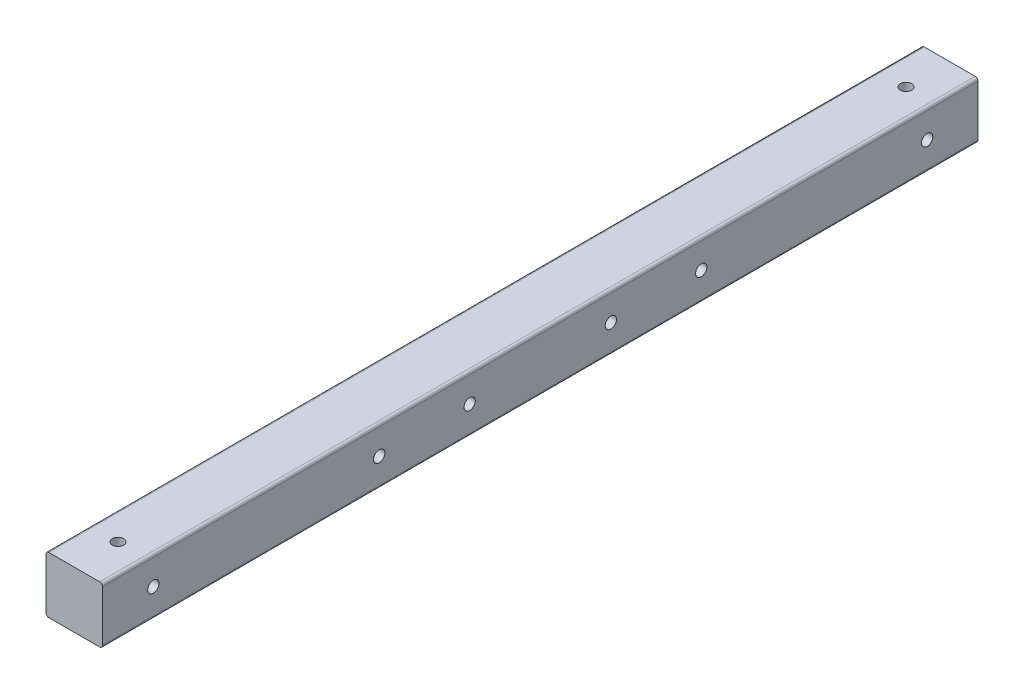
ISO-10303-21;
HEADER;
FILE_DESCRIPTION(('STEP AP214'),'2;1');
FILE_NAME('part.step','',(''),(''),'','','');
FILE_SCHEMA(('AUTOMOTIVE_DESIGN { 1 0 10303 214 1 1 1 1 }'));
ENDSEC;
DATA;
#1=APPLICATION_CONTEXT('core data for automotive mechanical design processes');
#2=APPLICATION_PROTOCOL_DEFINITION('international standard','automotive_design',2000,#1);
#3=PRODUCT_CONTEXT('',#1,'mechanical');
#4=PRODUCT('Part','Part','',(#3));
#5=PRODUCT_RELATED_PRODUCT_CATEGORY('part','',(#4));
#6=PRODUCT_DEFINITION_FORMATION('','',#4);
#7=PRODUCT_DEFINITION_CONTEXT('part definition',#1,'design');
#8=PRODUCT_DEFINITION('design','',#6,#7);
#9=PRODUCT_DEFINITION_SHAPE('','',#8);
#10=(LENGTH_UNIT() NAMED_UNIT(*) SI_UNIT(.MILLI.,.METRE.));
#11=(NAMED_UNIT(*) PLANE_ANGLE_UNIT() SI_UNIT($,.RADIAN.));
#12=(NAMED_UNIT(*) SI_UNIT($,.STERADIAN.) SOLID_ANGLE_UNIT());
#13=UNCERTAINTY_MEASURE_WITH_UNIT(LENGTH_MEASURE(1.E-05),#10,'distance_accuracy_value','');
#14=(GEOMETRIC_REPRESENTATION_CONTEXT(3) GLOBAL_UNCERTAINTY_ASSIGNED_CONTEXT((#13)) GLOBAL_UNIT_ASSIGNED_CONTEXT((#10,
#11,#12)) REPRESENTATION_CONTEXT('',''));
#15=CARTESIAN_POINT('',(0.,0.,0.));
#16=DIRECTION('',(0.,0.,1.));
#17=DIRECTION('',(1.,0.,0.));
#18=AXIS2_PLACEMENT_3D('',#15,#16,#17);
#19=CARTESIAN_POINT('',(0.,0.,310.));
#20=DIRECTION('',(1.,0.,0.));
#21=DIRECTION('',(0.,0.,-1.));
#22=AXIS2_PLACEMENT_3D('',#19,#20,#21);
#23=PLANE('',#22);
#24=CARTESIAN_POINT('',(0.,10.,18.));
#25=DIRECTION('',(-1.,0.,0.));
#26=DIRECTION('',(0.,0.,1.));
#27=AXIS2_PLACEMENT_3D('',#24,#25,#26);
#28=CIRCLE('',#27,2.);
#29=CARTESIAN_POINT('',(0.,10.,20.));
#30=VERTEX_POINT('',#29);
#31=EDGE_CURVE('E352',#30,#30,#28,.T.);
#32=ORIENTED_EDGE('',*,*,#31,.F.);
#33=EDGE_LOOP('',(#32));
#34=FACE_BOUND('',#33,.T.);
#35=CARTESIAN_POINT('',(0.,10.,212.));
#36=DIRECTION('',(-1.,0.,0.));
#37=DIRECTION('',(0.,0.,1.));
#38=AXIS2_PLACEMENT_3D('',#35,#36,#37);
#39=CIRCLE('',#38,2.);
#40=CARTESIAN_POINT('',(0.,10.,214.));
#41=VERTEX_POINT('',#40);
#42=EDGE_CURVE('E340',#41,#41,#39,.T.);
#43=ORIENTED_EDGE('',*,*,#42,.F.);
#44=EDGE_LOOP('',(#43));
#45=FACE_BOUND('',#44,.T.);
#46=CARTESIAN_POINT('',(0.,10.,130.));
#47=DIRECTION('',(-1.,0.,0.));
#48=DIRECTION('',(0.,0.,1.));
#49=AXIS2_PLACEMENT_3D('',#46,#47,#48);
#50=CIRCLE('',#49,2.);
#51=CARTESIAN_POINT('',(0.,10.,132.));
#52=VERTEX_POINT('',#51);
#53=EDGE_CURVE('E343',#52,#52,#50,.T.);
#54=ORIENTED_EDGE('',*,*,#53,.F.);
#55=EDGE_LOOP('',(#54));
#56=FACE_BOUND('',#55,.T.);
#57=CARTESIAN_POINT('',(0.,10.,180.));
#58=DIRECTION('',(-1.,0.,0.));
#59=DIRECTION('',(0.,0.,1.));
#60=AXIS2_PLACEMENT_3D('',#57,#58,#59);
#61=CIRCLE('',#60,2.);
#62=CARTESIAN_POINT('',(0.,10.,182.));
#63=VERTEX_POINT('',#62);
#64=EDGE_CURVE('E347',#63,#63,#61,.T.);
#65=ORIENTED_EDGE('',*,*,#64,.F.);
#66=EDGE_LOOP('',(#65));
#67=FACE_BOUND('',#66,.T.);
#68=CARTESIAN_POINT('',(0.,10.,292.));
#69=DIRECTION('',(-1.,0.,0.));
#70=DIRECTION('',(0.,0.,1.));
#71=AXIS2_PLACEMENT_3D('',#68,#69,#70);
#72=CIRCLE('',#71,2.);
#73=CARTESIAN_POINT('',(0.,10.,294.));
#74=VERTEX_POINT('',#73);
#75=EDGE_CURVE('E350',#74,#74,#72,.T.);
#76=ORIENTED_EDGE('',*,*,#75,.F.);
#77=EDGE_LOOP('',(#76));
#78=FACE_BOUND('',#77,.T.);
#79=CARTESIAN_POINT('',(0.,10.,98.));
#80=DIRECTION('',(-1.,0.,0.));
#81=DIRECTION('',(0.,0.,1.));
#82=AXIS2_PLACEMENT_3D('',#79,#80,#81);
#83=CIRCLE('',#82,2.);
#84=CARTESIAN_POINT('',(0.,10.,100.));
#85=VERTEX_POINT('',#84);
#86=EDGE_CURVE('E196',#85,#85,#83,.T.);
#87=ORIENTED_EDGE('',*,*,#86,.F.);
#88=EDGE_LOOP('',(#87));
#89=FACE_BOUND('',#88,.T.);
#90=DIRECTION('',(0.,-1.,0.));
#91=VECTOR('',#90,1.);
#92=CARTESIAN_POINT('',(0.,0.,0.));
#93=LINE('',#92,#91);
#94=CARTESIAN_POINT('',(0.,19.,0.));
#95=VERTEX_POINT('',#94);
#96=CARTESIAN_POINT('',(0.,1.,0.));
#97=VERTEX_POINT('',#96);
#98=EDGE_CURVE('E142',#95,#97,#93,.T.);
#99=ORIENTED_EDGE('',*,*,#98,.T.);
#100=DIRECTION('',(0.,0.,-1.));
#101=VECTOR('',#100,1.);
#102=CARTESIAN_POINT('',(0.,1.,310.));
#103=LINE('',#102,#101);
#104=CARTESIAN_POINT('',(0.,1.,310.));
#105=VERTEX_POINT('',#104);
#106=EDGE_CURVE('E117',#97,#105,#103,.F.);
#107=ORIENTED_EDGE('',*,*,#106,.T.);
#108=DIRECTION('',(0.,-1.,0.));
#109=VECTOR('',#108,1.);
#110=CARTESIAN_POINT('',(0.,0.,310.));
#111=LINE('',#110,#109);
#112=CARTESIAN_POINT('',(0.,19.,310.));
#113=VERTEX_POINT('',#112);
#114=EDGE_CURVE('E155',#113,#105,#111,.T.);
#115=ORIENTED_EDGE('',*,*,#114,.F.);
#116=DIRECTION('',(0.,0.,-1.));
#117=VECTOR('',#116,1.);
#118=CARTESIAN_POINT('',(0.,19.,310.));
#119=LINE('',#118,#117);
#120=EDGE_CURVE('E123',#113,#95,#119,.T.);
#121=ORIENTED_EDGE('',*,*,#120,.T.);
#122=EDGE_LOOP('',(#99,#107,#115,#121));
#123=FACE_BOUND('',#122,.T.);
#124=ADVANCED_FACE('F38',(#34,#45,#56,#67,#78,#89,#123),#23,.F.);
#125=CARTESIAN_POINT('',(0.,0.,310.));
#126=DIRECTION('',(0.,1.,0.));
#127=DIRECTION('',(0.,0.,1.));
#128=AXIS2_PLACEMENT_3D('',#125,#126,#127);
#129=PLANE('',#128);
#130=CARTESIAN_POINT('',(10.,0.,15.5));
#131=DIRECTION('',(0.,-1.,0.));
#132=DIRECTION('',(0.,0.,-1.));
#133=AXIS2_PLACEMENT_3D('',#130,#131,#132);
#134=CIRCLE('',#133,2.);
#135=CARTESIAN_POINT('',(10.,0.,13.5));
#136=VERTEX_POINT('',#135);
#137=EDGE_CURVE('E369',#136,#136,#134,.T.);
#138=ORIENTED_EDGE('',*,*,#137,.F.);
#139=EDGE_LOOP('',(#138));
#140=FACE_BOUND('',#139,.T.);
#141=CARTESIAN_POINT('',(10.,0.,294.5));
#142=DIRECTION('',(0.,-1.,0.));
#143=DIRECTION('',(0.,0.,-1.));
#144=AXIS2_PLACEMENT_3D('',#141,#142,#143);
#145=CIRCLE('',#144,2.);
#146=CARTESIAN_POINT('',(10.,0.,292.5));
#147=VERTEX_POINT('',#146);
#148=EDGE_CURVE('E377',#147,#147,#145,.T.);
#149=ORIENTED_EDGE('',*,*,#148,.F.);
#150=EDGE_LOOP('',(#149));
#151=FACE_BOUND('',#150,.T.);
#152=DIRECTION('',(1.,0.,0.));
#153=VECTOR('',#152,1.);
#154=CARTESIAN_POINT('',(0.,0.,310.));
#155=LINE('',#154,#153);
#156=CARTESIAN_POINT('',(1.,0.,310.));
#157=VERTEX_POINT('',#156);
#158=CARTESIAN_POINT('',(19.,0.,310.));
#159=VERTEX_POINT('',#158);
#160=EDGE_CURVE('E133',#157,#159,#155,.T.);
#161=ORIENTED_EDGE('',*,*,#160,.F.);
#162=DIRECTION('',(0.,0.,-1.));
#163=VECTOR('',#162,1.);
#164=CARTESIAN_POINT('',(1.,0.,310.));
#165=LINE('',#164,#163);
#166=CARTESIAN_POINT('',(1.,0.,0.));
#167=VERTEX_POINT('',#166);
#168=EDGE_CURVE('E116',#157,#167,#165,.T.);
#169=ORIENTED_EDGE('',*,*,#168,.T.);
#170=DIRECTION('',(1.,0.,0.));
#171=VECTOR('',#170,1.);
#172=CARTESIAN_POINT('',(0.,0.,0.));
#173=LINE('',#172,#171);
#174=CARTESIAN_POINT('',(19.,0.,0.));
#175=VERTEX_POINT('',#174);
#176=EDGE_CURVE('E130',#167,#175,#173,.T.);
#177=ORIENTED_EDGE('',*,*,#176,.T.);
#178=DIRECTION('',(0.,0.,-1.));
#179=VECTOR('',#178,1.);
#180=CARTESIAN_POINT('',(19.,0.,310.));
#181=LINE('',#180,#179);
#182=EDGE_CURVE('E136',#175,#159,#181,.F.);
#183=ORIENTED_EDGE('',*,*,#182,.T.);
#184=EDGE_LOOP('',(#161,#169,#177,#183));
#185=FACE_BOUND('',#184,.T.);
#186=ADVANCED_FACE('F129',(#140,#151,#185),#129,.F.);
#187=CARTESIAN_POINT('',(20.,0.,310.));
#188=DIRECTION('',(-1.,0.,0.));
#189=DIRECTION('',(0.,0.,1.));
#190=AXIS2_PLACEMENT_3D('',#187,#188,#189);
#191=PLANE('',#190);
#192=CARTESIAN_POINT('',(20.,10.,18.));
#193=DIRECTION('',(-1.,0.,0.));
#194=DIRECTION('',(0.,0.,1.));
#195=AXIS2_PLACEMENT_3D('',#192,#193,#194);
#196=CIRCLE('',#195,2.);
#197=CARTESIAN_POINT('',(20.,10.,20.));
#198=VERTEX_POINT('',#197);
#199=EDGE_CURVE('E149',#198,#198,#196,.T.);
#200=ORIENTED_EDGE('',*,*,#199,.T.);
#201=EDGE_LOOP('',(#200));
#202=FACE_BOUND('',#201,.T.);
#203=CARTESIAN_POINT('',(20.,10.,212.));
#204=DIRECTION('',(-1.,0.,0.));
#205=DIRECTION('',(0.,0.,1.));
#206=AXIS2_PLACEMENT_3D('',#203,#204,#205);
#207=CIRCLE('',#206,2.);
#208=CARTESIAN_POINT('',(20.,10.,214.));
#209=VERTEX_POINT('',#208);
#210=EDGE_CURVE('E208',#209,#209,#207,.T.);
#211=ORIENTED_EDGE('',*,*,#210,.T.);
#212=EDGE_LOOP('',(#211));
#213=FACE_BOUND('',#212,.T.);
#214=CARTESIAN_POINT('',(20.,10.,130.));
#215=DIRECTION('',(-1.,0.,0.));
#216=DIRECTION('',(0.,0.,1.));
#217=AXIS2_PLACEMENT_3D('',#214,#215,#216);
#218=CIRCLE('',#217,2.);
#219=CARTESIAN_POINT('',(20.,10.,132.));
#220=VERTEX_POINT('',#219);
#221=EDGE_CURVE('E204',#220,#220,#218,.T.);
#222=ORIENTED_EDGE('',*,*,#221,.T.);
#223=EDGE_LOOP('',(#222));
#224=FACE_BOUND('',#223,.T.);
#225=CARTESIAN_POINT('',(20.,10.,180.));
#226=DIRECTION('',(-1.,0.,0.));
#227=DIRECTION('',(0.,0.,1.));
#228=AXIS2_PLACEMENT_3D('',#225,#226,#227);
#229=CIRCLE('',#228,2.);
#230=CARTESIAN_POINT('',(20.,10.,182.));
#231=VERTEX_POINT('',#230);
#232=EDGE_CURVE('E200',#231,#231,#229,.T.);
#233=ORIENTED_EDGE('',*,*,#232,.T.);
#234=EDGE_LOOP('',(#233));
#235=FACE_BOUND('',#234,.T.);
#236=CARTESIAN_POINT('',(20.,10.,292.));
#237=DIRECTION('',(-1.,0.,0.));
#238=DIRECTION('',(0.,0.,1.));
#239=AXIS2_PLACEMENT_3D('',#236,#237,#238);
#240=CIRCLE('',#239,2.);
#241=CARTESIAN_POINT('',(20.,10.,294.));
#242=VERTEX_POINT('',#241);
#243=EDGE_CURVE('E195',#242,#242,#240,.T.);
#244=ORIENTED_EDGE('',*,*,#243,.T.);
#245=EDGE_LOOP('',(#244));
#246=FACE_BOUND('',#245,.T.);
#247=CARTESIAN_POINT('',(20.,10.,98.));
#248=DIRECTION('',(-1.,0.,0.));
#249=DIRECTION('',(0.,0.,1.));
#250=AXIS2_PLACEMENT_3D('',#247,#248,#249);
#251=CIRCLE('',#250,2.);
#252=CARTESIAN_POINT('',(20.,10.,100.));
#253=VERTEX_POINT('',#252);
#254=EDGE_CURVE('E191',#253,#253,#251,.T.);
#255=ORIENTED_EDGE('',*,*,#254,.T.);
#256=EDGE_LOOP('',(#255));
#257=FACE_BOUND('',#256,.T.);
#258=DIRECTION('',(0.,1.,0.));
#259=VECTOR('',#258,1.);
#260=CARTESIAN_POINT('',(20.,0.,310.));
#261=LINE('',#260,#259);
#262=CARTESIAN_POINT('',(20.,1.,310.));
#263=VERTEX_POINT('',#262);
#264=CARTESIAN_POINT('',(20.,19.,310.));
#265=VERTEX_POINT('',#264);
#266=EDGE_CURVE('E294',#263,#265,#261,.T.);
#267=ORIENTED_EDGE('',*,*,#266,.F.);
#268=DIRECTION('',(0.,0.,-1.));
#269=VECTOR('',#268,1.);
#270=CARTESIAN_POINT('',(20.,1.,310.));
#271=LINE('',#270,#269);
#272=CARTESIAN_POINT('',(20.,1.,0.));
#273=VERTEX_POINT('',#272);
#274=EDGE_CURVE('E185',#263,#273,#271,.T.);
#275=ORIENTED_EDGE('',*,*,#274,.T.);
#276=DIRECTION('',(0.,1.,0.));
#277=VECTOR('',#276,1.);
#278=CARTESIAN_POINT('',(20.,0.,0.));
#279=LINE('',#278,#277);
#280=CARTESIAN_POINT('',(20.,19.,0.));
#281=VERTEX_POINT('',#280);
#282=EDGE_CURVE('E141',#273,#281,#279,.T.);
#283=ORIENTED_EDGE('',*,*,#282,.T.);
#284=DIRECTION('',(0.,0.,-1.));
#285=VECTOR('',#284,1.);
#286=CARTESIAN_POINT('',(20.,19.,310.));
#287=LINE('',#286,#285);
#288=EDGE_CURVE('E182',#281,#265,#287,.F.);
#289=ORIENTED_EDGE('',*,*,#288,.T.);
#290=EDGE_LOOP('',(#267,#275,#283,#289));
#291=FACE_BOUND('',#290,.T.);
#292=ADVANCED_FACE('F263',(#202,#213,#224,#235,#246,#257,#291),#191,.F.);
#293=CARTESIAN_POINT('',(0.,20.,310.));
#294=DIRECTION('',(0.,-1.,0.));
#295=DIRECTION('',(0.,0.,-1.));
#296=AXIS2_PLACEMENT_3D('',#293,#294,#295);
#297=PLANE('',#296);
#298=CARTESIAN_POINT('',(10.,20.,15.5));
#299=DIRECTION('',(0.,-1.,0.));
#300=DIRECTION('',(0.,0.,-1.));
#301=AXIS2_PLACEMENT_3D('',#298,#299,#300);
#302=CIRCLE('',#301,2.);
#303=CARTESIAN_POINT('',(10.,20.,13.5));
#304=VERTEX_POINT('',#303);
#305=EDGE_CURVE('E222',#304,#304,#302,.T.);
#306=ORIENTED_EDGE('',*,*,#305,.T.);
#307=EDGE_LOOP('',(#306));
#308=FACE_BOUND('',#307,.T.);
#309=CARTESIAN_POINT('',(10.,20.,294.5));
#310=DIRECTION('',(0.,-1.,0.));
#311=DIRECTION('',(0.,0.,-1.));
#312=AXIS2_PLACEMENT_3D('',#309,#310,#311);
#313=CIRCLE('',#312,2.);
#314=CARTESIAN_POINT('',(10.,20.,292.5));
#315=VERTEX_POINT('',#314);
#316=EDGE_CURVE('E373',#315,#315,#313,.T.);
#317=ORIENTED_EDGE('',*,*,#316,.T.);
#318=EDGE_LOOP('',(#317));
#319=FACE_BOUND('',#318,.T.);
#320=DIRECTION('',(-1.,0.,0.));
#321=VECTOR('',#320,1.);
#322=CARTESIAN_POINT('',(0.,20.,310.));
#323=LINE('',#322,#321);
#324=CARTESIAN_POINT('',(19.,20.,310.));
#325=VERTEX_POINT('',#324);
#326=CARTESIAN_POINT('',(1.,20.,310.));
#327=VERTEX_POINT('',#326);
#328=EDGE_CURVE('E157',#325,#327,#323,.T.);
#329=ORIENTED_EDGE('',*,*,#328,.F.);
#330=DIRECTION('',(0.,0.,-1.));
#331=VECTOR('',#330,1.);
#332=CARTESIAN_POINT('',(19.,20.,310.));
#333=LINE('',#332,#331);
#334=CARTESIAN_POINT('',(19.,20.,0.));
#335=VERTEX_POINT('',#334);
#336=EDGE_CURVE('E11',#325,#335,#333,.T.);
#337=ORIENTED_EDGE('',*,*,#336,.T.);
#338=DIRECTION('',(-1.,0.,0.));
#339=VECTOR('',#338,1.);
#340=CARTESIAN_POINT('',(0.,20.,0.));
#341=LINE('',#340,#339);
#342=CARTESIAN_POINT('',(1.,20.,0.));
#343=VERTEX_POINT('',#342);
#344=EDGE_CURVE('E147',#335,#343,#341,.T.);
#345=ORIENTED_EDGE('',*,*,#344,.T.);
#346=DIRECTION('',(0.,0.,-1.));
#347=VECTOR('',#346,1.);
#348=CARTESIAN_POINT('',(1.,20.,310.));
#349=LINE('',#348,#347);
#350=EDGE_CURVE('E53',#343,#327,#349,.F.);
#351=ORIENTED_EDGE('',*,*,#350,.T.);
#352=EDGE_LOOP('',(#329,#337,#345,#351));
#353=FACE_BOUND('',#352,.T.);
#354=ADVANCED_FACE('F285',(#308,#319,#353),#297,.F.);
#355=CARTESIAN_POINT('',(0.,0.,310.));
#356=DIRECTION('',(0.,0.,-1.));
#357=DIRECTION('',(-1.,0.,0.));
#358=AXIS2_PLACEMENT_3D('',#355,#356,#357);
#359=PLANE('',#358);
#360=ORIENTED_EDGE('',*,*,#114,.T.);
#361=CARTESIAN_POINT('',(1.,1.,310.));
#362=DIRECTION('',(0.,0.,-1.));
#363=DIRECTION('',(-1.,0.,0.));
#364=AXIS2_PLACEMENT_3D('',#361,#362,#363);
#365=CIRCLE('',#364,1.);
#366=EDGE_CURVE('E179',#105,#157,#365,.F.);
#367=ORIENTED_EDGE('',*,*,#366,.T.);
#368=ORIENTED_EDGE('',*,*,#160,.T.);
#369=CARTESIAN_POINT('',(19.,1.,310.));
#370=DIRECTION('',(0.,0.,-1.));
#371=DIRECTION('',(-1.,0.,0.));
#372=AXIS2_PLACEMENT_3D('',#369,#370,#371);
#373=CIRCLE('',#372,1.);
#374=EDGE_CURVE('E176',#159,#263,#373,.F.);
#375=ORIENTED_EDGE('',*,*,#374,.T.);
#376=ORIENTED_EDGE('',*,*,#266,.T.);
#377=CARTESIAN_POINT('',(19.,19.,310.));
#378=DIRECTION('',(0.,0.,-1.));
#379=DIRECTION('',(-1.,0.,0.));
#380=AXIS2_PLACEMENT_3D('',#377,#378,#379);
#381=CIRCLE('',#380,1.);
#382=EDGE_CURVE('E67',#265,#325,#381,.F.);
#383=ORIENTED_EDGE('',*,*,#382,.T.);
#384=ORIENTED_EDGE('',*,*,#328,.T.);
#385=CARTESIAN_POINT('',(1.,19.,310.));
#386=DIRECTION('',(0.,0.,-1.));
#387=DIRECTION('',(-1.,0.,0.));
#388=AXIS2_PLACEMENT_3D('',#385,#386,#387);
#389=CIRCLE('',#388,1.);
#390=EDGE_CURVE('E171',#327,#113,#389,.F.);
#391=ORIENTED_EDGE('',*,*,#390,.T.);
#392=EDGE_LOOP('',(#360,#367,#368,#375,#376,#383,#384,#391));
#393=FACE_BOUND('',#392,.T.);
#394=ADVANCED_FACE('F301',(#393),#359,.F.);
#395=CARTESIAN_POINT('',(0.,0.,0.));
#396=DIRECTION('',(0.,0.,-1.));
#397=DIRECTION('',(-1.,0.,0.));
#398=AXIS2_PLACEMENT_3D('',#395,#396,#397);
#399=PLANE('',#398);
#400=ORIENTED_EDGE('',*,*,#176,.F.);
#401=CARTESIAN_POINT('',(1.,1.,0.));
#402=DIRECTION('',(0.,0.,-1.));
#403=DIRECTION('',(-1.,0.,0.));
#404=AXIS2_PLACEMENT_3D('',#401,#402,#403);
#405=CIRCLE('',#404,1.);
#406=EDGE_CURVE('E112',#167,#97,#405,.T.);
#407=ORIENTED_EDGE('',*,*,#406,.T.);
#408=ORIENTED_EDGE('',*,*,#98,.F.);
#409=CARTESIAN_POINT('',(1.,19.,0.));
#410=DIRECTION('',(0.,0.,-1.));
#411=DIRECTION('',(-1.,0.,0.));
#412=AXIS2_PLACEMENT_3D('',#409,#410,#411);
#413=CIRCLE('',#412,1.);
#414=EDGE_CURVE('E135',#95,#343,#413,.T.);
#415=ORIENTED_EDGE('',*,*,#414,.T.);
#416=ORIENTED_EDGE('',*,*,#344,.F.);
#417=CARTESIAN_POINT('',(19.,19.,0.));
#418=DIRECTION('',(0.,0.,-1.));
#419=DIRECTION('',(-1.,0.,0.));
#420=AXIS2_PLACEMENT_3D('',#417,#418,#419);
#421=CIRCLE('',#420,1.);
#422=EDGE_CURVE('E161',#335,#281,#421,.T.);
#423=ORIENTED_EDGE('',*,*,#422,.T.);
#424=ORIENTED_EDGE('',*,*,#282,.F.);
#425=CARTESIAN_POINT('',(19.,1.,0.));
#426=DIRECTION('',(0.,0.,-1.));
#427=DIRECTION('',(-1.,0.,0.));
#428=AXIS2_PLACEMENT_3D('',#425,#426,#427);
#429=CIRCLE('',#428,1.);
#430=EDGE_CURVE('E124',#273,#175,#429,.T.);
#431=ORIENTED_EDGE('',*,*,#430,.T.);
#432=EDGE_LOOP('',(#400,#407,#408,#415,#416,#423,#424,#431));
#433=FACE_BOUND('',#432,.T.);
#434=ADVANCED_FACE('F138',(#433),#399,.T.);
#435=CARTESIAN_POINT('',(1.,1.,310.));
#436=DIRECTION('',(0.,0.,-1.));
#437=DIRECTION('',(-1.,0.,0.));
#438=AXIS2_PLACEMENT_3D('',#435,#436,#437);
#439=CYLINDRICAL_SURFACE('',#438,1.);
#440=ORIENTED_EDGE('',*,*,#366,.F.);
#441=ORIENTED_EDGE('',*,*,#106,.F.);
#442=ORIENTED_EDGE('',*,*,#406,.F.);
#443=ORIENTED_EDGE('',*,*,#168,.F.);
#444=EDGE_LOOP('',(#440,#441,#442,#443));
#445=FACE_BOUND('',#444,.T.);
#446=ADVANCED_FACE('F115',(#445),#439,.T.);
#447=CARTESIAN_POINT('',(19.,1.,310.));
#448=DIRECTION('',(0.,0.,-1.));
#449=DIRECTION('',(-1.,0.,0.));
#450=AXIS2_PLACEMENT_3D('',#447,#448,#449);
#451=CYLINDRICAL_SURFACE('',#450,1.);
#452=ORIENTED_EDGE('',*,*,#374,.F.);
#453=ORIENTED_EDGE('',*,*,#182,.F.);
#454=ORIENTED_EDGE('',*,*,#430,.F.);
#455=ORIENTED_EDGE('',*,*,#274,.F.);
#456=EDGE_LOOP('',(#452,#453,#454,#455));
#457=FACE_BOUND('',#456,.T.);
#458=ADVANCED_FACE('F272',(#457),#451,.T.);
#459=CARTESIAN_POINT('',(19.,19.,310.));
#460=DIRECTION('',(0.,0.,-1.));
#461=DIRECTION('',(-1.,0.,0.));
#462=AXIS2_PLACEMENT_3D('',#459,#460,#461);
#463=CYLINDRICAL_SURFACE('',#462,1.);
#464=ORIENTED_EDGE('',*,*,#382,.F.);
#465=ORIENTED_EDGE('',*,*,#288,.F.);
#466=ORIENTED_EDGE('',*,*,#422,.F.);
#467=ORIENTED_EDGE('',*,*,#336,.F.);
#468=EDGE_LOOP('',(#464,#465,#466,#467));
#469=FACE_BOUND('',#468,.T.);
#470=ADVANCED_FACE('F274',(#469),#463,.T.);
#471=CARTESIAN_POINT('',(1.,19.,310.));
#472=DIRECTION('',(0.,0.,-1.));
#473=DIRECTION('',(-1.,0.,0.));
#474=AXIS2_PLACEMENT_3D('',#471,#472,#473);
#475=CYLINDRICAL_SURFACE('',#474,1.);
#476=ORIENTED_EDGE('',*,*,#390,.F.);
#477=ORIENTED_EDGE('',*,*,#350,.F.);
#478=ORIENTED_EDGE('',*,*,#414,.F.);
#479=ORIENTED_EDGE('',*,*,#120,.F.);
#480=EDGE_LOOP('',(#476,#477,#478,#479));
#481=FACE_BOUND('',#480,.T.);
#482=ADVANCED_FACE('F40',(#481),#475,.T.);
#483=CARTESIAN_POINT('',(310.,10.,98.));
#484=DIRECTION('',(-1.,0.,0.));
#485=DIRECTION('',(0.,0.,1.));
#486=AXIS2_PLACEMENT_3D('',#483,#484,#485);
#487=CYLINDRICAL_SURFACE('',#486,2.);
#488=ORIENTED_EDGE('',*,*,#86,.T.);
#489=EDGE_LOOP('',(#488));
#490=FACE_BOUND('',#489,.T.);
#491=ORIENTED_EDGE('',*,*,#254,.F.);
#492=EDGE_LOOP('',(#491));
#493=FACE_BOUND('',#492,.T.);
#494=ADVANCED_FACE('F244',(#490,#493),#487,.F.);
#495=CARTESIAN_POINT('',(310.,10.,292.));
#496=DIRECTION('',(-1.,0.,0.));
#497=DIRECTION('',(0.,0.,1.));
#498=AXIS2_PLACEMENT_3D('',#495,#496,#497);
#499=CYLINDRICAL_SURFACE('',#498,2.);
#500=CARTESIAN_POINT('',(11.9364916731037,10.,294.));
#501=CARTESIAN_POINT('',(11.936491962976,10.1057370513445,293.999999114104));
#502=CARTESIAN_POINT('',(11.9343792705104,10.2114780941693,293.991592415181));
#503=CARTESIAN_POINT('',(11.9252995483003,10.4201287267569,293.958226925435));
#504=CARTESIAN_POINT('',(11.9183319520868,10.523037984651,293.933266203107));
#505=CARTESIAN_POINT('',(11.897694527891,10.7233486502057,293.867591646943));
#506=CARTESIAN_POINT('',(11.8840064724412,10.82073427058,293.826835034611));
#507=CARTESIAN_POINT('',(11.8471310839096,11.006499068649,293.731425545481));
#508=CARTESIAN_POINT('',(11.8239499090124,11.0948840387381,293.67678168604));
#509=CARTESIAN_POINT('',(11.7665042940141,11.2551688769143,293.560081024952));
#510=CARTESIAN_POINT('',(11.732887852125,11.3276917895768,293.498566188858));
#511=CARTESIAN_POINT('',(11.652221250134,11.4595418452455,293.37046303585));
#512=CARTESIAN_POINT('',(11.6051853094024,11.5188828381297,293.30388014354));
#513=CARTESIAN_POINT('',(11.5031491499882,11.6176452514541,293.178512428559));
#514=CARTESIAN_POINT('',(11.449623190221,11.6585504977131,293.119686461771));
#515=CARTESIAN_POINT('',(11.3322508218487,11.7298246727199,293.006087211161));
#516=CARTESIAN_POINT('',(11.2684017812798,11.7601909082213,292.951314966078));
#517=CARTESIAN_POINT('',(11.1323575428333,11.8116362227011,292.849254638919));
#518=CARTESIAN_POINT('',(11.0602160857634,11.8327712662464,292.801922603094));
#519=CARTESIAN_POINT('',(10.9090879551215,11.867849439905,292.71643387656));
#520=CARTESIAN_POINT('',(10.8300987235572,11.8817898688251,292.678280634864));
#521=CARTESIAN_POINT('',(10.6585659705195,11.905400635427,292.609043523189));
#522=CARTESIAN_POINT('',(10.5654700986492,11.9144689350932,292.579122545733));
#523=CARTESIAN_POINT('',(10.3755787051406,11.9277765636102,292.533149691002));
#524=CARTESIAN_POINT('',(10.2787816420771,11.9320138573586,292.517103659355));
#525=CARTESIAN_POINT('',(10.0752334336118,11.9368853474197,292.498583993976));
#526=CARTESIAN_POINT('',(9.96835215019823,11.9371719916679,292.497420191451));
#527=CARTESIAN_POINT('',(9.75582745086092,11.9333405669,292.51210074967));
#528=CARTESIAN_POINT('',(9.65018450494122,11.9292208769291,292.527951369504));
#529=CARTESIAN_POINT('',(9.44098899620184,11.9152335440061,292.57666195553));
#530=CARTESIAN_POINT('',(9.33751776243617,11.9052550267526,292.609848620354));
#531=CARTESIAN_POINT('',(9.18815436680614,11.8840637860018,292.671386322251));
#532=CARTESIAN_POINT('',(9.13931860212898,11.8759574467142,292.69387202801));
#533=CARTESIAN_POINT('',(9.04399396578778,11.8572606018405,292.742471593701));
#534=CARTESIAN_POINT('',(8.99750383871245,11.8466714425994,292.768583484163));
#535=CARTESIAN_POINT('',(8.90945689652016,11.8231714166072,292.82272279313));
#536=CARTESIAN_POINT('',(8.86777042343423,11.8103961934051,292.850598363877));
#537=CARTESIAN_POINT('',(8.78728399767254,11.7818693168415,292.908841463329));
#538=CARTESIAN_POINT('',(8.74848249884068,11.7661192740469,292.939207638611));
#539=CARTESIAN_POINT('',(8.67410459437801,11.7313337190209,293.001880346798));
#540=CARTESIAN_POINT('',(8.63852530899584,11.7123011854986,293.034185103348));
#541=CARTESIAN_POINT('',(8.57083009593255,11.6707171196713,293.100103337059));
#542=CARTESIAN_POINT('',(8.53871371371308,11.6481660501601,293.13371664167));
#543=CARTESIAN_POINT('',(8.45480283333466,11.580585229489,293.227675135988));
#544=CARTESIAN_POINT('',(8.40685627307053,11.5316002818342,293.288709600273));
#545=CARTESIAN_POINT('',(8.32252453704951,11.4222619746465,293.408455164796));
#546=CARTESIAN_POINT('',(8.28614018667645,11.3619078039961,293.467166098903));
#547=CARTESIAN_POINT('',(8.22512411487583,11.2339395951497,293.57611985294));
#548=CARTESIAN_POINT('',(8.20005466792758,11.1667488024386,293.626618101322));
#549=CARTESIAN_POINT('',(8.15782915441676,11.0247836992638,293.719601452288));
#550=CARTESIAN_POINT('',(8.14067589248949,10.9500067125057,293.762083711732));
#551=CARTESIAN_POINT('',(8.11127936191156,10.7877816499405,293.840713786833));
#552=CARTESIAN_POINT('',(8.09960551249127,10.6997978932292,293.875967337652));
#553=CARTESIAN_POINT('',(8.08159401884313,10.5192272697038,293.933754130441));
#554=CARTESIAN_POINT('',(8.07525871298546,10.426638404561,293.956281796842));
#555=CARTESIAN_POINT('',(8.06614831451243,10.2294740535727,293.989552529265));
#556=CARTESIAN_POINT('',(8.06379973851859,10.1246356407469,293.998867753864));
#557=CARTESIAN_POINT('',(8.06326700618688,9.9147573429531,294.000938265991));
#558=CARTESIAN_POINT('',(8.06508438504977,9.8097173979701,293.993687448753));
#559=CARTESIAN_POINT('',(8.07356287104574,9.59854581703201,293.96230315919));
#560=CARTESIAN_POINT('',(8.08039413628454,9.49250847370617,293.937577768155));
#561=CARTESIAN_POINT('',(8.1010165699529,9.28635165950003,293.871466393851));
#562=CARTESIAN_POINT('',(8.11480768548848,9.18623214365147,293.830080537199));
#563=CARTESIAN_POINT('',(8.1426459257996,9.04455401757621,293.757796906218));
#564=CARTESIAN_POINT('',(8.15292092562537,8.99933699358249,293.732435525334));
#565=CARTESIAN_POINT('',(8.17620257516335,8.91151700684162,293.678644802058));
#566=CARTESIAN_POINT('',(8.18920779950509,8.86891269501158,293.650217064272));
#567=CARTESIAN_POINT('',(8.21831774924346,8.78673145417678,293.590769768154));
#568=CARTESIAN_POINT('',(8.23441961188734,8.74715177584734,293.559752618531));
#569=CARTESIAN_POINT('',(8.27005021523672,8.67133393249914,293.49569889644));
#570=CARTESIAN_POINT('',(8.28957846770448,8.63509529252543,293.462662612121));
#571=CARTESIAN_POINT('',(8.34918520073832,8.53915363506341,293.368685180984));
#572=CARTESIAN_POINT('',(8.39335619576077,8.48338080423829,293.306209812073));
#573=CARTESIAN_POINT('',(8.494063488831,8.38428152184325,293.181451877468));
#574=CARTESIAN_POINT('',(8.55059662611001,8.34095189531745,293.119169266609));
#575=CARTESIAN_POINT('',(8.6704515031555,8.26889372177849,293.003771899308));
#576=CARTESIAN_POINT('',(8.73294202342546,8.23931166571595,292.95031994444));
#577=CARTESIAN_POINT('',(8.86631848725856,8.18885370779667,292.850234805403));
#578=CARTESIAN_POINT('',(8.93720735785711,8.16798085284351,292.803604011308));
#579=CARTESIAN_POINT('',(9.0903232252203,8.13213133103468,292.716540589914));
#580=CARTESIAN_POINT('',(9.17298350314881,8.11761016844936,292.676685224449));
#581=CARTESIAN_POINT('',(9.34370541433089,8.09447774328672,292.60850815279));
#582=CARTESIAN_POINT('',(9.43176936268587,8.08586903332084,292.580191430373));
#583=CARTESIAN_POINT('',(9.62118770203449,8.07230221495007,292.533523392131));
#584=CARTESIAN_POINT('',(9.72293633662875,8.0678517718468,292.516616552054));
#585=CARTESIAN_POINT('',(9.92793364246469,8.06313856675677,292.498649048212));
#586=CARTESIAN_POINT('',(10.0311828601982,8.06287737073249,292.497594310055));
#587=CARTESIAN_POINT('',(10.2419917264786,8.06656155989535,292.511741035337));
#588=CARTESIAN_POINT('',(10.3494912408997,8.0707297053049,292.527803475048));
#589=CARTESIAN_POINT('',(10.5601629497409,8.08487155038121,292.577003429294));
#590=CARTESIAN_POINT('',(10.6633341592191,8.09484656384893,292.610144807735));
#591=CARTESIAN_POINT('',(10.8609350804657,8.12292001894719,292.69166576646));
#592=CARTESIAN_POINT('',(10.9554515895479,8.14092383409489,292.739865939278));
#593=CARTESIAN_POINT('',(11.133657051407,8.1881897498343,292.849030842064));
#594=CARTESIAN_POINT('',(11.2173586954921,8.21743849113556,292.909980386393));
#595=CARTESIAN_POINT('',(11.3639918003468,8.28694011117363,293.034416684682));
#596=CARTESIAN_POINT('',(11.4281146606496,8.32596551344837,293.097181241294));
#597=CARTESIAN_POINT('',(11.5433377553446,8.41715502934192,293.225045328483));
#598=CARTESIAN_POINT('',(11.5944467164696,8.46931029155012,293.290143260776));
#599=CARTESIAN_POINT('',(11.6791376771028,8.58066075481011,293.411226964096));
#600=CARTESIAN_POINT('',(11.713956621869,8.63864148689482,293.467475427881));
#601=CARTESIAN_POINT('',(11.7740105965264,8.7639108788377,293.574442682147));
#602=CARTESIAN_POINT('',(11.7992426893697,8.83120238256388,293.625159774639));
#603=CARTESIAN_POINT('',(11.8423733617344,8.97558194171705,293.719957853154));
#604=CARTESIAN_POINT('',(11.8600253113955,9.05290586375177,293.763789822428));
#605=CARTESIAN_POINT('',(11.8888016207691,9.21369373352778,293.841112819634));
#606=CARTESIAN_POINT('',(11.8999225351591,9.2971608959394,293.874598385113));
#607=CARTESIAN_POINT('',(11.9186946435705,9.48186259240331,293.934524456201));
#608=CARTESIAN_POINT('',(11.9255182973827,9.58381859508474,293.959011613046));
#609=CARTESIAN_POINT('',(11.9344175887648,9.79051438412313,293.991752969859));
#610=CARTESIAN_POINT('',(11.9364913859517,9.89525523360353,294.000000877583));
#611=CARTESIAN_POINT('',(11.9364916731037,10.,294.));
#612=B_SPLINE_CURVE_WITH_KNOTS('',3,(#500,#501,#502,#503,#504,#505,#506,#507,#508,#509,#510,
#511,#512,#513,#514,#515,#516,#517,#518,#519,#520,#521,#522,#523,#524,#525,#526,#527,#528,#529,
#530,#531,#532,#533,#534,#535,#536,#537,#538,#539,#540,#541,#542,#543,#544,#545,#546,#547,#548,
#549,#550,#551,#552,#553,#554,#555,#556,#557,#558,#559,#560,#561,#562,#563,#564,#565,#566,#567,
#568,#569,#570,#571,#572,#573,#574,#575,#576,#577,#578,#579,#580,#581,#582,#583,#584,#585,#586,
#587,#588,#589,#590,#591,#592,#593,#594,#595,#596,#597,#598,#599,#600,#601,#602,#603,#604,#605,
#606,#607,#608,#609,#610,#611),.UNSPECIFIED.,.T.,.F.,(4,2,2,2,2,2,2,2,2,2,2,2,2,2,2,2,2,2,2,2,2,
2,2,2,2,2,2,2,2,2,2,2,2,2,2,2,2,2,2,2,2,2,2,2,2,2,2,2,2,2,2,2,2,2,2,4),(0.,0.316862232524635,
0.633761442655424,0.951524946121602,1.26908264217348,1.56991609895995,1.87043196746024,
2.13741623001476,2.40446867030209,2.66987882552746,2.93538855571844,3.22877626186868,
3.52228751447276,3.84147014202189,4.16077022744145,4.48631699463295,4.64924572293543,
4.81208630427635,4.96712009228764,5.12207018437693,5.27688039919675,5.43167026893128,
5.70543118815817,5.97921164578652,6.24123106174188,6.50334323775869,6.78867002562715,
7.07412172646955,7.38854012318837,7.70307440521391,8.02880775247185,8.35453862423516,
8.51291202774618,8.67120295383653,8.82934824192792,8.98747101364287,9.26980792931973,
9.55207274095416,9.81309242528513,10.0742033506285,10.3518010030008,10.629518428723,
10.937881577279,11.2463599909081,11.5711205687437,11.8959546520677,12.2170575043811,
12.5377800503932,12.8296338357444,13.1212913941676,13.3839684745421,13.6467259644484,
13.9174823202242,14.1883813803253,14.5021484805689,14.8160371326888),.UNSPECIFIED.);
#613=CARTESIAN_POINT('',(11.9364916731037,10.,294.));
#614=VERTEX_POINT('',#613);
#615=EDGE_CURVE('E42',#614,#614,#612,.T.);
#616=ORIENTED_EDGE('',*,*,#615,.T.);
#617=EDGE_LOOP('',(#616));
#618=FACE_BOUND('',#617,.T.);
#619=ORIENTED_EDGE('',*,*,#75,.T.);
#620=EDGE_LOOP('',(#619));
#621=FACE_BOUND('',#620,.T.);
#622=ORIENTED_EDGE('',*,*,#243,.F.);
#623=EDGE_LOOP('',(#622));
#624=FACE_BOUND('',#623,.T.);
#625=ADVANCED_FACE('F239',(#618,#621,#624),#499,.F.);
#626=CARTESIAN_POINT('',(310.,10.,180.));
#627=DIRECTION('',(-1.,0.,0.));
#628=DIRECTION('',(0.,0.,1.));
#629=AXIS2_PLACEMENT_3D('',#626,#627,#628);
#630=CYLINDRICAL_SURFACE('',#629,2.);
#631=ORIENTED_EDGE('',*,*,#64,.T.);
#632=EDGE_LOOP('',(#631));
#633=FACE_BOUND('',#632,.T.);
#634=ORIENTED_EDGE('',*,*,#232,.F.);
#635=EDGE_LOOP('',(#634));
#636=FACE_BOUND('',#635,.T.);
#637=ADVANCED_FACE('F236',(#633,#636),#630,.F.);
#638=CARTESIAN_POINT('',(310.,10.,130.));
#639=DIRECTION('',(-1.,0.,0.));
#640=DIRECTION('',(0.,0.,1.));
#641=AXIS2_PLACEMENT_3D('',#638,#639,#640);
#642=CYLINDRICAL_SURFACE('',#641,2.);
#643=ORIENTED_EDGE('',*,*,#53,.T.);
#644=EDGE_LOOP('',(#643));
#645=FACE_BOUND('',#644,.T.);
#646=ORIENTED_EDGE('',*,*,#221,.F.);
#647=EDGE_LOOP('',(#646));
#648=FACE_BOUND('',#647,.T.);
#649=ADVANCED_FACE('F238',(#645,#648),#642,.F.);
#650=CARTESIAN_POINT('',(310.,10.,212.));
#651=DIRECTION('',(-1.,0.,0.));
#652=DIRECTION('',(0.,0.,1.));
#653=AXIS2_PLACEMENT_3D('',#650,#651,#652);
#654=CYLINDRICAL_SURFACE('',#653,2.);
#655=ORIENTED_EDGE('',*,*,#42,.T.);
#656=EDGE_LOOP('',(#655));
#657=FACE_BOUND('',#656,.T.);
#658=ORIENTED_EDGE('',*,*,#210,.F.);
#659=EDGE_LOOP('',(#658));
#660=FACE_BOUND('',#659,.T.);
#661=ADVANCED_FACE('F246',(#657,#660),#654,.F.);
#662=CARTESIAN_POINT('',(310.,10.,18.));
#663=DIRECTION('',(-1.,0.,0.));
#664=DIRECTION('',(0.,0.,1.));
#665=AXIS2_PLACEMENT_3D('',#662,#663,#664);
#666=CYLINDRICAL_SURFACE('',#665,2.);
#667=CARTESIAN_POINT('',(11.9364916731037,10.,16.));
#668=CARTESIAN_POINT('',(11.936491962976,9.89426294865548,16.0000008858964));
#669=CARTESIAN_POINT('',(11.9343792705104,9.78852190583066,16.0084075848187));
#670=CARTESIAN_POINT('',(11.9252995483003,9.57987127324309,16.0417730745653));
#671=CARTESIAN_POINT('',(11.9183319520868,9.47696201534905,16.0667337968928));
#672=CARTESIAN_POINT('',(11.897694527891,9.27665134979426,16.1324083530571));
#673=CARTESIAN_POINT('',(11.8840064724412,9.17926572941994,16.1731649653888));
#674=CARTESIAN_POINT('',(11.8471310839096,8.99350093135095,16.2685744545189));
#675=CARTESIAN_POINT('',(11.8239499090124,8.90511596126188,16.3232183139603));
#676=CARTESIAN_POINT('',(11.7665042940141,8.74483112308568,16.439918975048));
#677=CARTESIAN_POINT('',(11.732887852125,8.67230821042319,16.5014338111421));
#678=CARTESIAN_POINT('',(11.652221250134,8.54045815475446,16.6295369641504));
#679=CARTESIAN_POINT('',(11.6051853094024,8.48111716187028,16.6961198564601));
#680=CARTESIAN_POINT('',(11.5031491499882,8.38235474854588,16.8214875714409));
#681=CARTESIAN_POINT('',(11.449623190221,8.3414495022869,16.8803135382292));
#682=CARTESIAN_POINT('',(11.3322508218487,8.27017532728011,16.993912788839));
#683=CARTESIAN_POINT('',(11.2684017812798,8.2398090917787,17.0486850339218));
#684=CARTESIAN_POINT('',(11.1323575428333,8.18836377729889,17.1507453610808));
#685=CARTESIAN_POINT('',(11.0602160857634,8.16722873375357,17.1980773969063));
#686=CARTESIAN_POINT('',(10.9090879551215,8.13215056009499,17.2835661234399));
#687=CARTESIAN_POINT('',(10.8300987235572,8.11821013117488,17.3217193651356));
#688=CARTESIAN_POINT('',(10.6585659705195,8.09459936457303,17.3909564768105));
#689=CARTESIAN_POINT('',(10.5654700986492,8.08553106490679,17.4208774542673));
#690=CARTESIAN_POINT('',(10.3755787051406,8.0722234363898,17.4668503089977));
#691=CARTESIAN_POINT('',(10.2787816420771,8.06798614264137,17.4828963406452));
#692=CARTESIAN_POINT('',(10.0752334336118,8.0631146525803,17.5014160060242));
#693=CARTESIAN_POINT('',(9.96835215019825,8.0628280083321,17.5025798085485));
#694=CARTESIAN_POINT('',(9.75582745086094,8.06665943309996,17.4878992503297));
#695=CARTESIAN_POINT('',(9.65018450494125,8.07077912307089,17.472048630496));
#696=CARTESIAN_POINT('',(9.44098899620186,8.08476645599387,17.4233380444698));
#697=CARTESIAN_POINT('',(9.33751776243619,8.09474497324741,17.390151379646));
#698=CARTESIAN_POINT('',(9.18815436680617,8.11593621399815,17.3286136777494));
#699=CARTESIAN_POINT('',(9.13931860212901,8.12404255328575,17.3061279719897));
#700=CARTESIAN_POINT('',(9.0439939657878,8.14273939815952,17.257528406299));
#701=CARTESIAN_POINT('',(8.99750383871247,8.1533285574006,17.231416515837));
#702=CARTESIAN_POINT('',(8.90945689652018,8.17682858339276,17.1772772068702));
#703=CARTESIAN_POINT('',(8.86777042343425,8.18960380659484,17.1494016361228));
#704=CARTESIAN_POINT('',(8.78728399767256,8.21813068315848,17.0911585366708));
#705=CARTESIAN_POINT('',(8.7484824988407,8.23388072595306,17.0607923613889));
#706=CARTESIAN_POINT('',(8.67410459437803,8.26866628097912,16.9981196532021));
#707=CARTESIAN_POINT('',(8.63852530899586,8.28769881450141,16.9658148966517));
#708=CARTESIAN_POINT('',(8.57083009593255,8.32928288032871,16.8998966629409));
#709=CARTESIAN_POINT('',(8.53871371371308,8.35183394983986,16.8662833583299));
#710=CARTESIAN_POINT('',(8.45480283333465,8.41941477051099,16.7723248640121));
#711=CARTESIAN_POINT('',(8.40685627307053,8.46839971816576,16.7112903997265));
#712=CARTESIAN_POINT('',(8.32252453704952,8.57773802535345,16.5915448352036));
#713=CARTESIAN_POINT('',(8.28614018667644,8.63809219600392,16.5328339010966));
#714=CARTESIAN_POINT('',(8.22512411487582,8.76606040485028,16.4238801470596));
#715=CARTESIAN_POINT('',(8.20005466792757,8.83325119756137,16.3733818986782));
#716=CARTESIAN_POINT('',(8.15782915441676,8.97521630073617,16.2803985477116));
#717=CARTESIAN_POINT('',(8.14067589248949,9.0499932874943,16.2379162882676));
#718=CARTESIAN_POINT('',(8.11127936191156,9.2122183500595,16.1592862131668));
#719=CARTESIAN_POINT('',(8.09960551249127,9.30020210677081,16.1240326623482));
#720=CARTESIAN_POINT('',(8.08159401884313,9.48077273029617,16.066245869559));
#721=CARTESIAN_POINT('',(8.07525871298546,9.57336159543902,16.0437182031584));
#722=CARTESIAN_POINT('',(8.06614831451243,9.77052594642723,16.0104474707346));
#723=CARTESIAN_POINT('',(8.06379973851858,9.87536435925305,16.0011322461363));
#724=CARTESIAN_POINT('',(8.06326700618687,10.0852426570469,15.9990617340087));
#725=CARTESIAN_POINT('',(8.06508438504977,10.1902826020299,16.0063125512472));
#726=CARTESIAN_POINT('',(8.07356287104574,10.401454182968,16.0376968408104));
#727=CARTESIAN_POINT('',(8.08039413628454,10.5074915262938,16.0624222318451));
#728=CARTESIAN_POINT('',(8.10101656995289,10.7136483405,16.1285336061493));
#729=CARTESIAN_POINT('',(8.11480768548848,10.8137678563485,16.1699194628009));
#730=CARTESIAN_POINT('',(8.1426459257996,10.9554459824238,16.2422030937817));
#731=CARTESIAN_POINT('',(8.15292092562537,11.0006630064175,16.2675644746658));
#732=CARTESIAN_POINT('',(8.17620257516335,11.0884829931584,16.3213551979421));
#733=CARTESIAN_POINT('',(8.18920779950508,11.1310873049884,16.3497829357284));
#734=CARTESIAN_POINT('',(8.21831774924345,11.2132685458232,16.4092302318464));
#735=CARTESIAN_POINT('',(8.23441961188733,11.2528482241527,16.4402473814692));
#736=CARTESIAN_POINT('',(8.27005021523671,11.3286660675009,16.5043011035605));
#737=CARTESIAN_POINT('',(8.28957846770447,11.3649047074746,16.5373373878791));
#738=CARTESIAN_POINT('',(8.3491852007383,11.4608463649366,16.6313148190161));
#739=CARTESIAN_POINT('',(8.39335619576076,11.5166191957617,16.6937901879269));
#740=CARTESIAN_POINT('',(8.49406348883097,11.6157184781567,16.8185481225323));
#741=CARTESIAN_POINT('',(8.55059662610996,11.6590481046825,16.880830733391));
#742=CARTESIAN_POINT('',(8.67045150315544,11.7311062782215,16.996228100692));
#743=CARTESIAN_POINT('',(8.7329420234254,11.760688334284,17.0496800555603));
#744=CARTESIAN_POINT('',(8.86631848725852,11.8111462922033,17.149765194597));
#745=CARTESIAN_POINT('',(8.93720735785709,11.8320191471565,17.1963959886915));
#746=CARTESIAN_POINT('',(9.09032322522029,11.8678686689653,17.2834594100858));
#747=CARTESIAN_POINT('',(9.17298350314879,11.8823898315506,17.3233147755509));
#748=CARTESIAN_POINT('',(9.34370541433086,11.9055222567133,17.39149184721));
#749=CARTESIAN_POINT('',(9.43176936268585,11.9141309666792,17.4198085696274));
#750=CARTESIAN_POINT('',(9.62118770203447,11.9276977850499,17.4664766078688));
#751=CARTESIAN_POINT('',(9.72293633662872,11.9321482281532,17.4833834479458));
#752=CARTESIAN_POINT('',(9.92793364246466,11.9368614332432,17.5013509517878));
#753=CARTESIAN_POINT('',(10.0311828601981,11.9371226292675,17.5024056899451));
#754=CARTESIAN_POINT('',(10.2419917264785,11.9334384401047,17.4882589646629));
#755=CARTESIAN_POINT('',(10.3494912408997,11.9292702946951,17.472196524952));
#756=CARTESIAN_POINT('',(10.5601629497408,11.9151284496188,17.4229965707061));
#757=CARTESIAN_POINT('',(10.6633341592191,11.9051534361511,17.3898551922646));
#758=CARTESIAN_POINT('',(10.8609350804657,11.8770799810528,17.3083342335398));
#759=CARTESIAN_POINT('',(10.9554515895478,11.8590761659051,17.2601340607224));
#760=CARTESIAN_POINT('',(11.1336570514069,11.8118102501657,17.1509691579364));
#761=CARTESIAN_POINT('',(11.217358695492,11.7825615088645,17.0900196136072));
#762=CARTESIAN_POINT('',(11.3639918003468,11.7130598888264,16.9655833153182));
#763=CARTESIAN_POINT('',(11.4281146606495,11.6740344865517,16.902818758706));
#764=CARTESIAN_POINT('',(11.5433377553446,11.5828449706581,16.7749546715166));
#765=CARTESIAN_POINT('',(11.5944467164696,11.5306897084499,16.7098567392242));
#766=CARTESIAN_POINT('',(11.6791376771028,11.4193392451899,16.5887730359035));
#767=CARTESIAN_POINT('',(11.713956621869,11.3613585131052,16.5325245721191));
#768=CARTESIAN_POINT('',(11.7740105965264,11.2360891211623,16.4255573178531));
#769=CARTESIAN_POINT('',(11.7992426893697,11.1687976174362,16.3748402253611));
#770=CARTESIAN_POINT('',(11.8423733617344,11.024418058283,16.2800421468459));
#771=CARTESIAN_POINT('',(11.8600253113955,10.9470941362483,16.236210177572));
#772=CARTESIAN_POINT('',(11.8888016207691,10.7863062664723,16.1588871803663));
#773=CARTESIAN_POINT('',(11.8999225351591,10.7028391040606,16.1254016148873));
#774=CARTESIAN_POINT('',(11.9186946435705,10.5181374075967,16.065475543799));
#775=CARTESIAN_POINT('',(11.9255182973827,10.4161814049153,16.0409883869539));
#776=CARTESIAN_POINT('',(11.9344175887648,10.2094856158769,16.0082470301406));
#777=CARTESIAN_POINT('',(11.9364913859517,10.1047447663965,15.9999991224173));
#778=CARTESIAN_POINT('',(11.9364916731037,10.,16.));
#779=B_SPLINE_CURVE_WITH_KNOTS('',3,(#667,#668,#669,#670,#671,#672,#673,#674,#675,#676,#677,
#678,#679,#680,#681,#682,#683,#684,#685,#686,#687,#688,#689,#690,#691,#692,#693,#694,#695,#696,
#697,#698,#699,#700,#701,#702,#703,#704,#705,#706,#707,#708,#709,#710,#711,#712,#713,#714,#715,
#716,#717,#718,#719,#720,#721,#722,#723,#724,#725,#726,#727,#728,#729,#730,#731,#732,#733,#734,
#735,#736,#737,#738,#739,#740,#741,#742,#743,#744,#745,#746,#747,#748,#749,#750,#751,#752,#753,
#754,#755,#756,#757,#758,#759,#760,#761,#762,#763,#764,#765,#766,#767,#768,#769,#770,#771,#772,
#773,#774,#775,#776,#777,#778),.UNSPECIFIED.,.T.,.F.,(4,2,2,2,2,2,2,2,2,2,2,2,2,2,2,2,2,2,2,2,2,
2,2,2,2,2,2,2,2,2,2,2,2,2,2,2,2,2,2,2,2,2,2,2,2,2,2,2,2,2,2,2,2,2,2,4),(0.,0.316862232524631,
0.633761442655418,0.951524946121627,1.26908264217348,1.56991609895995,1.87043196746023,
2.13741623001473,2.40446867030206,2.66987882552747,2.9353885557184,3.22877626186868,
3.52228751447277,3.84147014202189,4.16077022744145,4.48631699463294,4.64924572293541,
4.81208630427635,4.96712009228762,5.12207018437693,5.27688039919678,5.43167026893129,
5.7054311881582,5.97921164578655,6.24123106174189,6.50334323775869,6.78867002562715,
7.07412172646954,7.38854012318836,7.70307440521392,8.02880775247184,8.35453862423515,
8.51291202774624,8.67120295383656,8.82934824192795,8.98747101364289,9.26980792931971,
9.55207274095409,9.81309242528508,10.0742033506286,10.3518010030008,10.629518428723,
10.937881577279,11.2463599909081,11.5711205687437,11.8959546520677,12.2170575043811,
12.5377800503932,12.8296338357444,13.1212913941676,13.3839684745421,13.6467259644484,
13.9174823202242,14.1883813803253,14.502148480569,14.8160371326888),.UNSPECIFIED.);
#780=CARTESIAN_POINT('',(11.9364916731037,10.,16.));
#781=VERTEX_POINT('',#780);
#782=EDGE_CURVE('E214',#781,#781,#779,.T.);
#783=ORIENTED_EDGE('',*,*,#782,.T.);
#784=EDGE_LOOP('',(#783));
#785=FACE_BOUND('',#784,.T.);
#786=ORIENTED_EDGE('',*,*,#31,.T.);
#787=EDGE_LOOP('',(#786));
#788=FACE_BOUND('',#787,.T.);
#789=ORIENTED_EDGE('',*,*,#199,.F.);
#790=EDGE_LOOP('',(#789));
#791=FACE_BOUND('',#790,.T.);
#792=ADVANCED_FACE('F223',(#785,#788,#791),#666,.F.);
#793=CARTESIAN_POINT('',(10.,20.,15.5));
#794=DIRECTION('',(0.,-1.,0.));
#795=DIRECTION('',(0.,0.,-1.));
#796=AXIS2_PLACEMENT_3D('',#793,#794,#795);
#797=CYLINDRICAL_SURFACE('',#796,2.);
#798=ORIENTED_EDGE('',*,*,#137,.T.);
#799=EDGE_LOOP('',(#798));
#800=FACE_BOUND('',#799,.T.);
#801=ORIENTED_EDGE('',*,*,#305,.F.);
#802=EDGE_LOOP('',(#801));
#803=FACE_BOUND('',#802,.T.);
#804=ORIENTED_EDGE('',*,*,#782,.F.);
#805=EDGE_LOOP('',(#804));
#806=FACE_BOUND('',#805,.T.);
#807=ADVANCED_FACE('F227',(#800,#803,#806),#797,.F.);
#808=CARTESIAN_POINT('',(10.,20.,294.5));
#809=DIRECTION('',(0.,-1.,0.));
#810=DIRECTION('',(0.,0.,-1.));
#811=AXIS2_PLACEMENT_3D('',#808,#809,#810);
#812=CYLINDRICAL_SURFACE('',#811,2.);
#813=ORIENTED_EDGE('',*,*,#148,.T.);
#814=EDGE_LOOP('',(#813));
#815=FACE_BOUND('',#814,.T.);
#816=ORIENTED_EDGE('',*,*,#316,.F.);
#817=EDGE_LOOP('',(#816));
#818=FACE_BOUND('',#817,.T.);
#819=ORIENTED_EDGE('',*,*,#615,.F.);
#820=EDGE_LOOP('',(#819));
#821=FACE_BOUND('',#820,.T.);
#822=ADVANCED_FACE('F230',(#815,#818,#821),#812,.F.);
#823=CLOSED_SHELL('',(#124,#186,#292,#354,#394,#434,#446,#458,#470,#482,#494,#625,#637,#649,
#661,#792,#807,#822));
#824=MANIFOLD_SOLID_BREP('B2',#823);
#825=ADVANCED_BREP_SHAPE_REPRESENTATION('',(#18,#824),#14);
#826=SHAPE_DEFINITION_REPRESENTATION(#9,#825);
ENDSEC;
END-ISO-10303-21;
